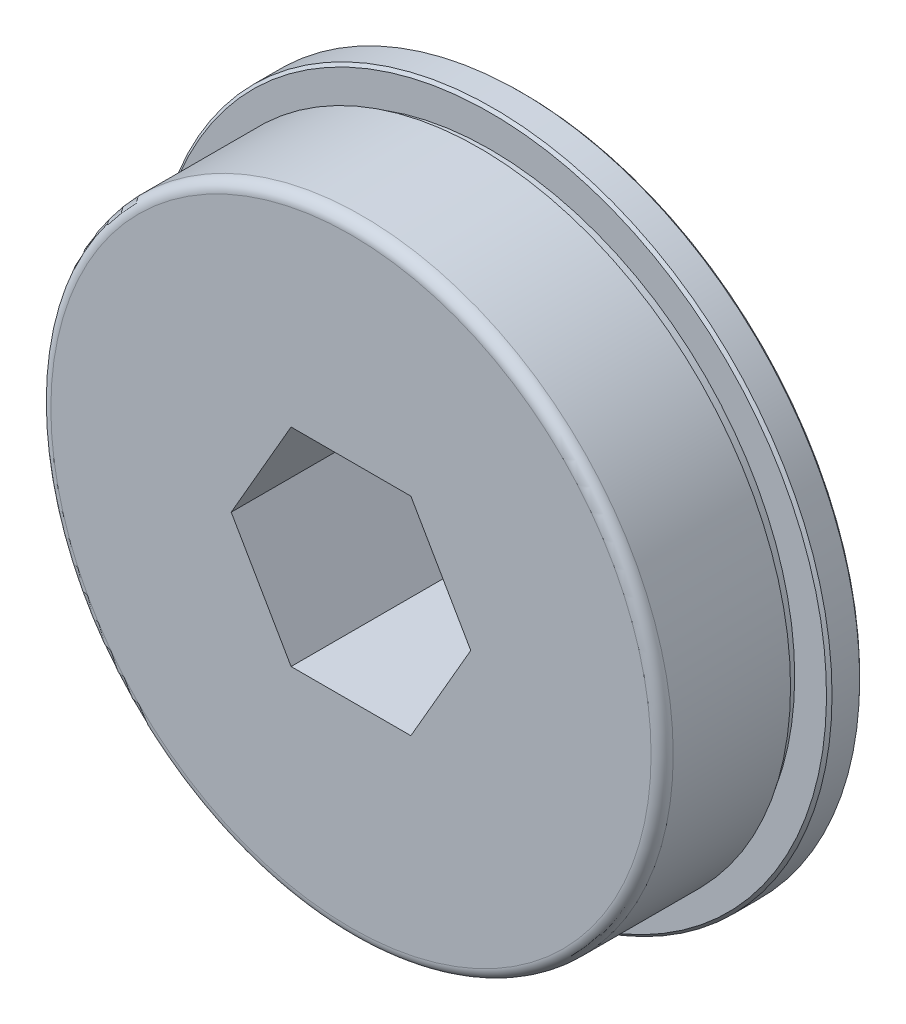
ISO-10303-21;
HEADER;
FILE_DESCRIPTION(('STEP AP214'),'2;1');
FILE_NAME('part.step','',(''),(''),'','','');
FILE_SCHEMA(('AUTOMOTIVE_DESIGN { 1 0 10303 214 1 1 1 1 }'));
ENDSEC;
DATA;
#1=APPLICATION_CONTEXT('core data for automotive mechanical design processes');
#2=APPLICATION_PROTOCOL_DEFINITION('international standard','automotive_design',2000,#1);
#3=PRODUCT_CONTEXT('',#1,'mechanical');
#4=PRODUCT('Part','Part','',(#3));
#5=PRODUCT_RELATED_PRODUCT_CATEGORY('part','',(#4));
#6=PRODUCT_DEFINITION_FORMATION('','',#4);
#7=PRODUCT_DEFINITION_CONTEXT('part definition',#1,'design');
#8=PRODUCT_DEFINITION('design','',#6,#7);
#9=PRODUCT_DEFINITION_SHAPE('','',#8);
#10=(LENGTH_UNIT() NAMED_UNIT(*) SI_UNIT(.MILLI.,.METRE.));
#11=(NAMED_UNIT(*) PLANE_ANGLE_UNIT() SI_UNIT($,.RADIAN.));
#12=(NAMED_UNIT(*) SI_UNIT($,.STERADIAN.) SOLID_ANGLE_UNIT());
#13=UNCERTAINTY_MEASURE_WITH_UNIT(LENGTH_MEASURE(1.E-05),#10,'distance_accuracy_value','');
#14=(GEOMETRIC_REPRESENTATION_CONTEXT(3) GLOBAL_UNCERTAINTY_ASSIGNED_CONTEXT((#13)) GLOBAL_UNIT_ASSIGNED_CONTEXT((#10,
#11,#12)) REPRESENTATION_CONTEXT('',''));
#15=CARTESIAN_POINT('',(0.,0.,0.));
#16=DIRECTION('',(0.,0.,1.));
#17=DIRECTION('',(1.,0.,0.));
#18=AXIS2_PLACEMENT_3D('',#15,#16,#17);
#19=CARTESIAN_POINT('',(0.,0.,57.007125));
#20=DIRECTION('',(0.,0.,1.));
#21=DIRECTION('',(-1.,0.,0.));
#22=AXIS2_PLACEMENT_3D('',#19,#20,#21);
#23=CYLINDRICAL_SURFACE('',#22,13.97);
#24=CARTESIAN_POINT('',(0.,0.,-5.89534));
#25=DIRECTION('',(0.,0.,-1.));
#26=DIRECTION('',(-1.,0.,0.));
#27=AXIS2_PLACEMENT_3D('',#24,#25,#26);
#28=CIRCLE('',#27,13.97);
#29=CARTESIAN_POINT('',(-13.97,0.,-5.89534));
#30=VERTEX_POINT('',#29);
#31=EDGE_CURVE('E42',#30,#30,#28,.F.);
#32=ORIENTED_EDGE('',*,*,#31,.F.);
#33=EDGE_LOOP('',(#32));
#34=FACE_BOUND('',#33,.T.);
#35=CARTESIAN_POINT('',(0.,0.,-6.40333999999999));
#36=DIRECTION('',(0.,0.,-1.));
#37=DIRECTION('',(-1.,0.,0.));
#38=AXIS2_PLACEMENT_3D('',#35,#36,#37);
#39=CIRCLE('',#38,13.97);
#40=CARTESIAN_POINT('',(-13.97,0.,-6.40333999999999));
#41=VERTEX_POINT('',#40);
#42=EDGE_CURVE('E140',#41,#41,#39,.F.);
#43=ORIENTED_EDGE('',*,*,#42,.T.);
#44=EDGE_LOOP('',(#43));
#45=FACE_BOUND('',#44,.T.);
#46=ADVANCED_FACE('F38',(#34,#45),#23,.T.);
#47=CARTESIAN_POINT('',(0.,47.3069264516129,-5.89534));
#48=DIRECTION('',(0.,0.,1.));
#49=DIRECTION('',(-1.,0.,0.));
#50=AXIS2_PLACEMENT_3D('',#47,#48,#49);
#51=PLANE('',#50);
#52=CARTESIAN_POINT('',(0.,0.,-5.89534));
#53=DIRECTION('',(0.,0.,1.));
#54=DIRECTION('',(1.,0.,0.));
#55=AXIS2_PLACEMENT_3D('',#52,#53,#54);
#56=CIRCLE('',#55,14.2875);
#57=CARTESIAN_POINT('',(14.2875,0.,-5.89534));
#58=VERTEX_POINT('',#57);
#59=EDGE_CURVE('E138',#58,#58,#56,.F.);
#60=ORIENTED_EDGE('',*,*,#59,.T.);
#61=EDGE_LOOP('',(#60));
#62=FACE_BOUND('',#61,.T.);
#63=ORIENTED_EDGE('',*,*,#31,.T.);
#64=EDGE_LOOP('',(#63));
#65=FACE_BOUND('',#64,.T.);
#66=ADVANCED_FACE('F147',(#62,#65),#51,.F.);
#67=CARTESIAN_POINT('',(0.,0.,-6.40334));
#68=DIRECTION('',(0.,0.,1.));
#69=DIRECTION('',(-1.,0.,0.));
#70=AXIS2_PLACEMENT_3D('',#67,#68,#69);
#71=PLANE('',#70);
#72=CARTESIAN_POINT('',(0.,0.,-6.40334000000001));
#73=DIRECTION('',(0.,0.,1.));
#74=DIRECTION('',(0.,-1.,0.));
#75=AXIS2_PLACEMENT_3D('',#72,#73,#74);
#76=CIRCLE('',#75,15.4305);
#77=CARTESIAN_POINT('',(0.,-15.4305,-6.40334000000001));
#78=VERTEX_POINT('',#77);
#79=EDGE_CURVE('E128',#78,#78,#76,.T.);
#80=ORIENTED_EDGE('',*,*,#79,.T.);
#81=EDGE_LOOP('',(#80));
#82=FACE_BOUND('',#81,.T.);
#83=ORIENTED_EDGE('',*,*,#42,.F.);
#84=EDGE_LOOP('',(#83));
#85=FACE_BOUND('',#84,.T.);
#86=ADVANCED_FACE('F153',(#82,#85),#71,.T.);
#87=CARTESIAN_POINT('',(0.,0.,-6.40334));
#88=DIRECTION('',(0.,0.,-1.));
#89=DIRECTION('',(1.,0.,0.));
#90=AXIS2_PLACEMENT_3D('',#87,#88,#89);
#91=CYLINDRICAL_SURFACE('',#90,14.2875);
#92=CARTESIAN_POINT('',(0.,0.,-0.508));
#93=DIRECTION('',(0.,0.,-1.));
#94=DIRECTION('',(-1.,0.,0.));
#95=AXIS2_PLACEMENT_3D('',#92,#93,#94);
#96=CIRCLE('',#95,14.2875);
#97=CARTESIAN_POINT('',(-14.2875,0.,-0.508));
#98=VERTEX_POINT('',#97);
#99=EDGE_CURVE('E125',#98,#98,#96,.T.);
#100=ORIENTED_EDGE('',*,*,#99,.T.);
#101=EDGE_LOOP('',(#100));
#102=FACE_BOUND('',#101,.T.);
#103=ORIENTED_EDGE('',*,*,#59,.F.);
#104=EDGE_LOOP('',(#103));
#105=FACE_BOUND('',#104,.T.);
#106=ADVANCED_FACE('F159',(#102,#105),#91,.T.);
#107=CARTESIAN_POINT('',(0.,0.,-6.53034));
#108=DIRECTION('',(0.,0.,-1.));
#109=DIRECTION('',(0.,-1.,0.));
#110=AXIS2_PLACEMENT_3D('',#107,#108,#109);
#111=CONICAL_SURFACE('',#110,15.5575000000007,0.785398163400003);
#112=CARTESIAN_POINT('',(0.,0.,-6.53034));
#113=DIRECTION('',(0.,0.,1.));
#114=DIRECTION('',(1.,0.,0.));
#115=AXIS2_PLACEMENT_3D('',#112,#113,#114);
#116=CIRCLE('',#115,15.5575);
#117=CARTESIAN_POINT('',(15.5575,0.,-6.53034));
#118=VERTEX_POINT('',#117);
#119=EDGE_CURVE('E122',#118,#118,#116,.T.);
#120=ORIENTED_EDGE('',*,*,#119,.T.);
#121=EDGE_LOOP('',(#120));
#122=FACE_BOUND('',#121,.T.);
#123=ORIENTED_EDGE('',*,*,#79,.F.);
#124=EDGE_LOOP('',(#123));
#125=FACE_BOUND('',#124,.T.);
#126=ADVANCED_FACE('F163',(#122,#125),#111,.T.);
#127=CARTESIAN_POINT('',(0.,0.,-0.508000000000006));
#128=DIRECTION('',(0.,0.,1.));
#129=DIRECTION('',(-1.,0.,0.));
#130=AXIS2_PLACEMENT_3D('',#127,#128,#129);
#131=TOROIDAL_SURFACE('',#130,13.7795,0.508000000000003);
#132=ORIENTED_EDGE('',*,*,#99,.F.);
#133=EDGE_LOOP('',(#132));
#134=FACE_BOUND('',#133,.T.);
#135=CARTESIAN_POINT('',(0.,0.,0.));
#136=DIRECTION('',(0.,0.,-1.));
#137=DIRECTION('',(-1.,0.,0.));
#138=AXIS2_PLACEMENT_3D('',#135,#136,#137);
#139=CIRCLE('',#138,13.7795);
#140=CARTESIAN_POINT('',(-13.7795,0.,0.));
#141=VERTEX_POINT('',#140);
#142=EDGE_CURVE('E121',#141,#141,#139,.T.);
#143=ORIENTED_EDGE('',*,*,#142,.T.);
#144=EDGE_LOOP('',(#143));
#145=FACE_BOUND('',#144,.T.);
#146=ADVANCED_FACE('F40',(#134,#145),#131,.T.);
#147=CARTESIAN_POINT('',(0.,0.,-7.92734));
#148=DIRECTION('',(0.,0.,-1.));
#149=DIRECTION('',(1.,0.,0.));
#150=AXIS2_PLACEMENT_3D('',#147,#148,#149);
#151=CYLINDRICAL_SURFACE('',#150,15.5575);
#152=CARTESIAN_POINT('',(0.,0.,-7.80033999999999));
#153=DIRECTION('',(0.,0.,-1.));
#154=DIRECTION('',(-1.,0.,0.));
#155=AXIS2_PLACEMENT_3D('',#152,#153,#154);
#156=CIRCLE('',#155,15.5575);
#157=CARTESIAN_POINT('',(-15.5575,0.,-7.80033999999999));
#158=VERTEX_POINT('',#157);
#159=EDGE_CURVE('E111',#158,#158,#156,.F.);
#160=ORIENTED_EDGE('',*,*,#159,.T.);
#161=EDGE_LOOP('',(#160));
#162=FACE_BOUND('',#161,.T.);
#163=ORIENTED_EDGE('',*,*,#119,.F.);
#164=EDGE_LOOP('',(#163));
#165=FACE_BOUND('',#164,.T.);
#166=ADVANCED_FACE('F168',(#162,#165),#151,.T.);
#167=CARTESIAN_POINT('',(0.,0.,0.));
#168=DIRECTION('',(0.,0.,1.));
#169=DIRECTION('',(-1.,0.,0.));
#170=AXIS2_PLACEMENT_3D('',#167,#168,#169);
#171=PLANE('',#170);
#172=DIRECTION('',(0.5,0.866025403784439,0.));
#173=VECTOR('',#172,1.);
#174=CARTESIAN_POINT('',(2.74963065701561,-4.7625,0.));
#175=LINE('',#174,#173);
#176=CARTESIAN_POINT('',(2.74963065701561,-4.7625,0.));
#177=VERTEX_POINT('',#176);
#178=CARTESIAN_POINT('',(5.4992613140312,0.,0.));
#179=VERTEX_POINT('',#178);
#180=EDGE_CURVE('E102',#177,#179,#175,.T.);
#181=ORIENTED_EDGE('',*,*,#180,.F.);
#182=DIRECTION('',(1.,0.,0.));
#183=VECTOR('',#182,1.);
#184=CARTESIAN_POINT('',(-2.74963065701557,-4.7625,0.));
#185=LINE('',#184,#183);
#186=CARTESIAN_POINT('',(-2.74963065701557,-4.7625,0.));
#187=VERTEX_POINT('',#186);
#188=EDGE_CURVE('E95',#187,#177,#185,.T.);
#189=ORIENTED_EDGE('',*,*,#188,.F.);
#190=DIRECTION('',(0.5,-0.866025403784438,0.));
#191=VECTOR('',#190,1.);
#192=CARTESIAN_POINT('',(-5.49926131403117,0.,0.));
#193=LINE('',#192,#191);
#194=CARTESIAN_POINT('',(-5.49926131403117,0.,0.));
#195=VERTEX_POINT('',#194);
#196=EDGE_CURVE('E105',#195,#187,#193,.T.);
#197=ORIENTED_EDGE('',*,*,#196,.F.);
#198=DIRECTION('',(-0.499999999999999,-0.866025403784439,0.));
#199=VECTOR('',#198,1.);
#200=CARTESIAN_POINT('',(-2.74963065701558,4.76249999999999,0.));
#201=LINE('',#200,#199);
#202=CARTESIAN_POINT('',(-2.74963065701558,4.7625,0.));
#203=VERTEX_POINT('',#202);
#204=EDGE_CURVE('E218',#203,#195,#201,.T.);
#205=ORIENTED_EDGE('',*,*,#204,.F.);
#206=DIRECTION('',(-1.,0.,0.));
#207=VECTOR('',#206,1.);
#208=CARTESIAN_POINT('',(2.7496306570156,4.7625,0.));
#209=LINE('',#208,#207);
#210=CARTESIAN_POINT('',(2.7496306570156,4.7625,0.));
#211=VERTEX_POINT('',#210);
#212=EDGE_CURVE('E222',#211,#203,#209,.T.);
#213=ORIENTED_EDGE('',*,*,#212,.F.);
#214=DIRECTION('',(-0.500000000000001,0.866025403784438,0.));
#215=VECTOR('',#214,1.);
#216=CARTESIAN_POINT('',(5.4992613140312,0.,0.));
#217=LINE('',#216,#215);
#218=EDGE_CURVE('E227',#179,#211,#217,.T.);
#219=ORIENTED_EDGE('',*,*,#218,.F.);
#220=EDGE_LOOP('',(#181,#189,#197,#205,#213,#219));
#221=FACE_BOUND('',#220,.T.);
#222=ORIENTED_EDGE('',*,*,#142,.F.);
#223=EDGE_LOOP('',(#222));
#224=FACE_BOUND('',#223,.T.);
#225=ADVANCED_FACE('F113',(#221,#224),#171,.T.);
#226=CARTESIAN_POINT('',(0.,0.,-7.80033999999999));
#227=DIRECTION('',(0.,0.,1.));
#228=DIRECTION('',(-1.,0.,0.));
#229=AXIS2_PLACEMENT_3D('',#226,#227,#228);
#230=CONICAL_SURFACE('',#229,15.5575,0.785398163400003);
#231=ORIENTED_EDGE('',*,*,#159,.F.);
#232=EDGE_LOOP('',(#231));
#233=FACE_BOUND('',#232,.T.);
#234=CARTESIAN_POINT('',(0.,0.,-7.92733999999967));
#235=DIRECTION('',(0.,0.,-1.));
#236=DIRECTION('',(-1.,0.,0.));
#237=AXIS2_PLACEMENT_3D('',#234,#235,#236);
#238=CIRCLE('',#237,15.4304999999997);
#239=CARTESIAN_POINT('',(-15.4304999999997,0.,-7.92733999999967));
#240=VERTEX_POINT('',#239);
#241=EDGE_CURVE('E129',#240,#240,#238,.T.);
#242=ORIENTED_EDGE('',*,*,#241,.F.);
#243=EDGE_LOOP('',(#242));
#244=FACE_BOUND('',#243,.T.);
#245=ADVANCED_FACE('F174',(#233,#244),#230,.T.);
#246=CARTESIAN_POINT('',(-5.49926131403117,0.,-7.92734));
#247=DIRECTION('',(-0.866025403784438,-0.5,0.));
#248=DIRECTION('',(0.5,-0.866025403784438,0.));
#249=AXIS2_PLACEMENT_3D('',#246,#247,#248);
#250=PLANE('',#249);
#251=DIRECTION('',(0.500000000000001,-0.866025403784438,0.));
#252=VECTOR('',#251,1.);
#253=CARTESIAN_POINT('',(-5.49926131403117,0.,-7.92734));
#254=LINE('',#253,#252);
#255=CARTESIAN_POINT('',(-5.49926131403117,0.,-7.92734));
#256=VERTEX_POINT('',#255);
#257=CARTESIAN_POINT('',(-2.74963065701557,-4.7625,-7.92734));
#258=VERTEX_POINT('',#257);
#259=EDGE_CURVE('E132',#256,#258,#254,.T.);
#260=ORIENTED_EDGE('',*,*,#259,.F.);
#261=DIRECTION('',(0.,0.,-1.));
#262=VECTOR('',#261,1.);
#263=CARTESIAN_POINT('',(-5.49926131403117,0.,-7.92734));
#264=LINE('',#263,#262);
#265=EDGE_CURVE('E107',#195,#256,#264,.T.);
#266=ORIENTED_EDGE('',*,*,#265,.F.);
#267=ORIENTED_EDGE('',*,*,#196,.T.);
#268=DIRECTION('',(0.,0.,-1.));
#269=VECTOR('',#268,1.);
#270=CARTESIAN_POINT('',(-2.74963065701557,-4.7625,-7.92734));
#271=LINE('',#270,#269);
#272=EDGE_CURVE('E91',#258,#187,#271,.F.);
#273=ORIENTED_EDGE('',*,*,#272,.F.);
#274=EDGE_LOOP('',(#260,#266,#267,#273));
#275=FACE_BOUND('',#274,.T.);
#276=ADVANCED_FACE('F106',(#275),#250,.F.);
#277=CARTESIAN_POINT('',(-2.74963065701557,-4.7625,-7.92734));
#278=DIRECTION('',(0.,-1.,0.));
#279=DIRECTION('',(1.,0.,0.));
#280=AXIS2_PLACEMENT_3D('',#277,#278,#279);
#281=PLANE('',#280);
#282=DIRECTION('',(-1.,0.,0.));
#283=VECTOR('',#282,1.);
#284=CARTESIAN_POINT('',(0.,-4.7625,-7.92734));
#285=LINE('',#284,#283);
#286=CARTESIAN_POINT('',(2.74963065701561,-4.7625,-7.92734));
#287=VERTEX_POINT('',#286);
#288=EDGE_CURVE('E98',#258,#287,#285,.F.);
#289=ORIENTED_EDGE('',*,*,#288,.F.);
#290=ORIENTED_EDGE('',*,*,#272,.T.);
#291=ORIENTED_EDGE('',*,*,#188,.T.);
#292=DIRECTION('',(0.,0.,-1.));
#293=VECTOR('',#292,1.);
#294=CARTESIAN_POINT('',(2.74963065701561,-4.7625,-7.92734));
#295=LINE('',#294,#293);
#296=EDGE_CURVE('E86',#287,#177,#295,.F.);
#297=ORIENTED_EDGE('',*,*,#296,.F.);
#298=EDGE_LOOP('',(#289,#290,#291,#297));
#299=FACE_BOUND('',#298,.T.);
#300=ADVANCED_FACE('F93',(#299),#281,.F.);
#301=CARTESIAN_POINT('',(2.74963065701561,-4.7625,-7.92734));
#302=DIRECTION('',(0.866025403784439,-0.5,0.));
#303=DIRECTION('',(0.5,0.866025403784439,0.));
#304=AXIS2_PLACEMENT_3D('',#301,#302,#303);
#305=PLANE('',#304);
#306=DIRECTION('',(0.5,0.866025403784439,0.));
#307=VECTOR('',#306,1.);
#308=CARTESIAN_POINT('',(2.74963065701561,-4.7625,-7.92734));
#309=LINE('',#308,#307);
#310=CARTESIAN_POINT('',(5.4992613140312,0.,-7.92734));
#311=VERTEX_POINT('',#310);
#312=EDGE_CURVE('E210',#287,#311,#309,.T.);
#313=ORIENTED_EDGE('',*,*,#312,.F.);
#314=ORIENTED_EDGE('',*,*,#296,.T.);
#315=ORIENTED_EDGE('',*,*,#180,.T.);
#316=DIRECTION('',(0.,0.,-1.));
#317=VECTOR('',#316,1.);
#318=CARTESIAN_POINT('',(5.4992613140312,0.,-7.92734));
#319=LINE('',#318,#317);
#320=EDGE_CURVE('E225',#311,#179,#319,.F.);
#321=ORIENTED_EDGE('',*,*,#320,.F.);
#322=EDGE_LOOP('',(#313,#314,#315,#321));
#323=FACE_BOUND('',#322,.T.);
#324=ADVANCED_FACE('F182',(#323),#305,.F.);
#325=CARTESIAN_POINT('',(5.4992613140312,0.,-7.92734));
#326=DIRECTION('',(0.866025403784438,0.500000000000001,0.));
#327=DIRECTION('',(-0.500000000000001,0.866025403784438,0.));
#328=AXIS2_PLACEMENT_3D('',#325,#326,#327);
#329=PLANE('',#328);
#330=DIRECTION('',(-0.500000000000001,0.866025403784438,0.));
#331=VECTOR('',#330,1.);
#332=CARTESIAN_POINT('',(5.4992613140312,0.,-7.92734));
#333=LINE('',#332,#331);
#334=CARTESIAN_POINT('',(2.7496306570156,4.7625,-7.92734));
#335=VERTEX_POINT('',#334);
#336=EDGE_CURVE('E207',#311,#335,#333,.T.);
#337=ORIENTED_EDGE('',*,*,#336,.F.);
#338=ORIENTED_EDGE('',*,*,#320,.T.);
#339=ORIENTED_EDGE('',*,*,#218,.T.);
#340=DIRECTION('',(0.,0.,-1.));
#341=VECTOR('',#340,1.);
#342=CARTESIAN_POINT('',(2.7496306570156,4.7625,-7.92734));
#343=LINE('',#342,#341);
#344=EDGE_CURVE('E220',#335,#211,#343,.F.);
#345=ORIENTED_EDGE('',*,*,#344,.F.);
#346=EDGE_LOOP('',(#337,#338,#339,#345));
#347=FACE_BOUND('',#346,.T.);
#348=ADVANCED_FACE('F185',(#347),#329,.F.);
#349=CARTESIAN_POINT('',(2.7496306570156,4.7625,-7.92734));
#350=DIRECTION('',(0.,1.,0.));
#351=DIRECTION('',(-1.,0.,0.));
#352=AXIS2_PLACEMENT_3D('',#349,#350,#351);
#353=PLANE('',#352);
#354=DIRECTION('',(-1.,0.,0.));
#355=VECTOR('',#354,1.);
#356=CARTESIAN_POINT('',(0.,4.7625,-7.92734));
#357=LINE('',#356,#355);
#358=CARTESIAN_POINT('',(-2.74963065701558,4.7625,-7.92734));
#359=VERTEX_POINT('',#358);
#360=EDGE_CURVE('E48',#335,#359,#357,.T.);
#361=ORIENTED_EDGE('',*,*,#360,.F.);
#362=ORIENTED_EDGE('',*,*,#344,.T.);
#363=ORIENTED_EDGE('',*,*,#212,.T.);
#364=DIRECTION('',(0.,0.,-1.));
#365=VECTOR('',#364,1.);
#366=CARTESIAN_POINT('',(-2.74963065701558,4.76249999999999,-7.92734));
#367=LINE('',#366,#365);
#368=EDGE_CURVE('E133',#359,#203,#367,.F.);
#369=ORIENTED_EDGE('',*,*,#368,.F.);
#370=EDGE_LOOP('',(#361,#362,#363,#369));
#371=FACE_BOUND('',#370,.T.);
#372=ADVANCED_FACE('F188',(#371),#353,.F.);
#373=CARTESIAN_POINT('',(-2.74963065701558,4.76249999999999,-7.92734));
#374=DIRECTION('',(-0.866025403784439,0.499999999999999,0.));
#375=DIRECTION('',(-0.499999999999999,-0.866025403784439,0.));
#376=AXIS2_PLACEMENT_3D('',#373,#374,#375);
#377=PLANE('',#376);
#378=DIRECTION('',(-0.499999999999999,-0.866025403784439,0.));
#379=VECTOR('',#378,1.);
#380=CARTESIAN_POINT('',(-2.74963065701558,4.7625,-7.92734));
#381=LINE('',#380,#379);
#382=EDGE_CURVE('E11',#359,#256,#381,.T.);
#383=ORIENTED_EDGE('',*,*,#382,.F.);
#384=ORIENTED_EDGE('',*,*,#368,.T.);
#385=ORIENTED_EDGE('',*,*,#204,.T.);
#386=ORIENTED_EDGE('',*,*,#265,.T.);
#387=EDGE_LOOP('',(#383,#384,#385,#386));
#388=FACE_BOUND('',#387,.T.);
#389=ADVANCED_FACE('F192',(#388),#377,.F.);
#390=CARTESIAN_POINT('',(0.,0.,-7.92734));
#391=DIRECTION('',(0.,0.,1.));
#392=DIRECTION('',(-1.,0.,0.));
#393=AXIS2_PLACEMENT_3D('',#390,#391,#392);
#394=PLANE('',#393);
#395=ORIENTED_EDGE('',*,*,#360,.T.);
#396=ORIENTED_EDGE('',*,*,#382,.T.);
#397=ORIENTED_EDGE('',*,*,#259,.T.);
#398=ORIENTED_EDGE('',*,*,#288,.T.);
#399=ORIENTED_EDGE('',*,*,#312,.T.);
#400=ORIENTED_EDGE('',*,*,#336,.T.);
#401=EDGE_LOOP('',(#395,#396,#397,#398,#399,#400));
#402=FACE_BOUND('',#401,.T.);
#403=ORIENTED_EDGE('',*,*,#241,.T.);
#404=EDGE_LOOP('',(#403));
#405=FACE_BOUND('',#404,.T.);
#406=ADVANCED_FACE('F196',(#402,#405),#394,.F.);
#407=CLOSED_SHELL('',(#46,#66,#86,#106,#126,#146,#166,#225,#245,#276,#300,#324,#348,#372,#389,#406));
#408=MANIFOLD_SOLID_BREP('B2',#407);
#409=ADVANCED_BREP_SHAPE_REPRESENTATION('',(#18,#408),#14);
#410=SHAPE_DEFINITION_REPRESENTATION(#9,#409);
ENDSEC;
END-ISO-10303-21;
